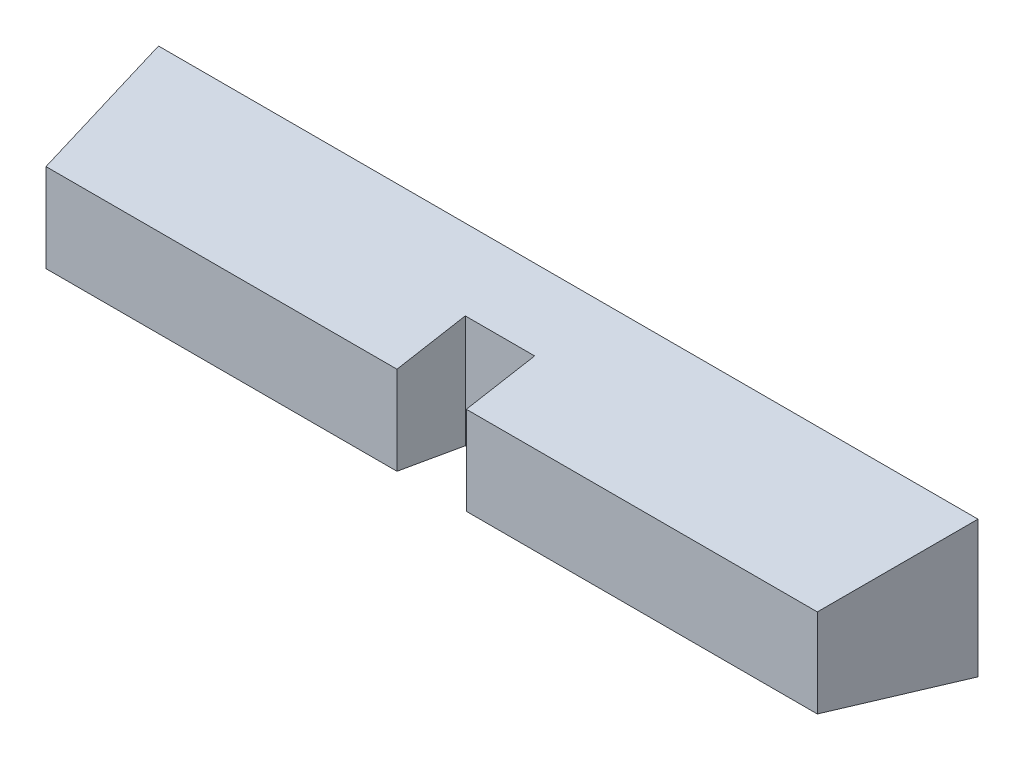
ISO-10303-21;
HEADER;
FILE_DESCRIPTION(('STEP AP214'),'2;1');
FILE_NAME('part.step','',(''),(''),'','','');
FILE_SCHEMA(('AUTOMOTIVE_DESIGN { 1 0 10303 214 1 1 1 1 }'));
ENDSEC;
DATA;
#1=APPLICATION_CONTEXT('core data for automotive mechanical design processes');
#2=APPLICATION_PROTOCOL_DEFINITION('international standard','automotive_design',2000,#1);
#3=PRODUCT_CONTEXT('',#1,'mechanical');
#4=PRODUCT('Part','Part','',(#3));
#5=PRODUCT_RELATED_PRODUCT_CATEGORY('part','',(#4));
#6=PRODUCT_DEFINITION_FORMATION('','',#4);
#7=PRODUCT_DEFINITION_CONTEXT('part definition',#1,'design');
#8=PRODUCT_DEFINITION('design','',#6,#7);
#9=PRODUCT_DEFINITION_SHAPE('','',#8);
#10=(LENGTH_UNIT() NAMED_UNIT(*) SI_UNIT(.MILLI.,.METRE.));
#11=(NAMED_UNIT(*) PLANE_ANGLE_UNIT() SI_UNIT($,.RADIAN.));
#12=(NAMED_UNIT(*) SI_UNIT($,.STERADIAN.) SOLID_ANGLE_UNIT());
#13=UNCERTAINTY_MEASURE_WITH_UNIT(LENGTH_MEASURE(1.E-05),#10,'distance_accuracy_value','');
#14=(GEOMETRIC_REPRESENTATION_CONTEXT(3) GLOBAL_UNCERTAINTY_ASSIGNED_CONTEXT((#13)) GLOBAL_UNIT_ASSIGNED_CONTEXT((#10,
#11,#12)) REPRESENTATION_CONTEXT('',''));
#15=CARTESIAN_POINT('',(0.,0.,0.));
#16=DIRECTION('',(0.,0.,1.));
#17=DIRECTION('',(1.,0.,0.));
#18=AXIS2_PLACEMENT_3D('',#15,#16,#17);
#19=CARTESIAN_POINT('',(30.,-5.,0.));
#20=DIRECTION('',(0.,-0.984807753012208,0.173648177666931));
#21=DIRECTION('',(0.,-0.173648177666931,-0.984807753012208));
#22=AXIS2_PLACEMENT_3D('',#19,#20,#21);
#23=PLANE('',#22);
#24=DIRECTION('',(1.,0.,0.));
#25=VECTOR('',#24,1.);
#26=CARTESIAN_POINT('',(30.,-4.11836509645767,5.));
#27=LINE('',#26,#25);
#28=CARTESIAN_POINT('',(-2.54,-4.11836509645767,5.));
#29=VERTEX_POINT('',#28);
#30=CARTESIAN_POINT('',(2.54,-4.11836509645767,5.));
#31=VERTEX_POINT('',#30);
#32=EDGE_CURVE('E160',#29,#31,#27,.T.);
#33=ORIENTED_EDGE('',*,*,#32,.F.);
#34=DIRECTION('',(0.,0.173648177666931,0.984807753012208));
#35=VECTOR('',#34,1.);
#36=CARTESIAN_POINT('',(-2.54,-5.,0.));
#37=LINE('',#36,#35);
#38=CARTESIAN_POINT('',(-2.54,-3.23673019291535,10.));
#39=VERTEX_POINT('',#38);
#40=EDGE_CURVE('E156',#29,#39,#37,.T.);
#41=ORIENTED_EDGE('',*,*,#40,.T.);
#42=DIRECTION('',(-1.,0.,0.));
#43=VECTOR('',#42,1.);
#44=CARTESIAN_POINT('',(0.,-3.23673019291535,10.));
#45=LINE('',#44,#43);
#46=CARTESIAN_POINT('',(-28.2367301929153,-3.23673019291535,10.));
#47=VERTEX_POINT('',#46);
#48=EDGE_CURVE('E90',#39,#47,#45,.T.);
#49=ORIENTED_EDGE('',*,*,#48,.T.);
#50=DIRECTION('',(-0.171087869746036,-0.171087869746036,-0.970287525247814));
#51=VECTOR('',#50,1.);
#52=CARTESIAN_POINT('',(-28.2437364495458,-3.24373644954581,9.96026554414808));
#53=LINE('',#52,#51);
#54=CARTESIAN_POINT('',(-30.,-5.,0.));
#55=VERTEX_POINT('',#54);
#56=EDGE_CURVE('E148',#47,#55,#53,.T.);
#57=ORIENTED_EDGE('',*,*,#56,.T.);
#58=DIRECTION('',(-1.,0.,0.));
#59=VECTOR('',#58,1.);
#60=CARTESIAN_POINT('',(30.,-5.,0.));
#61=LINE('',#60,#59);
#62=CARTESIAN_POINT('',(30.,-5.,0.));
#63=VERTEX_POINT('',#62);
#64=EDGE_CURVE('E192',#63,#55,#61,.T.);
#65=ORIENTED_EDGE('',*,*,#64,.F.);
#66=DIRECTION('',(-0.171087869746036,0.171087869746036,0.970287525247814));
#67=VECTOR('',#66,1.);
#68=CARTESIAN_POINT('',(30.,-5.,0.));
#69=LINE('',#68,#67);
#70=CARTESIAN_POINT('',(28.2367301929154,-3.23673019291535,10.));
#71=VERTEX_POINT('',#70);
#72=EDGE_CURVE('E70',#71,#63,#69,.F.);
#73=ORIENTED_EDGE('',*,*,#72,.F.);
#74=CARTESIAN_POINT('',(2.54,-3.23673019291535,10.));
#75=VERTEX_POINT('',#74);
#76=EDGE_CURVE('E166',#71,#75,#45,.T.);
#77=ORIENTED_EDGE('',*,*,#76,.T.);
#78=DIRECTION('',(0.,0.173648177666931,0.984807753012208));
#79=VECTOR('',#78,1.);
#80=CARTESIAN_POINT('',(2.54,-5.,0.));
#81=LINE('',#80,#79);
#82=EDGE_CURVE('E61',#31,#75,#81,.T.);
#83=ORIENTED_EDGE('',*,*,#82,.F.);
#84=EDGE_LOOP('',(#33,#41,#49,#57,#65,#73,#77,#83));
#85=FACE_BOUND('',#84,.T.);
#86=ADVANCED_FACE('F45',(#85),#23,.T.);
#87=CARTESIAN_POINT('',(30.,5.,0.));
#88=DIRECTION('',(0.,0.984807753012208,0.173648177666931));
#89=DIRECTION('',(0.,-0.173648177666931,0.984807753012208));
#90=AXIS2_PLACEMENT_3D('',#87,#88,#89);
#91=PLANE('',#90);
#92=DIRECTION('',(0.,0.173648177666931,-0.984807753012208));
#93=VECTOR('',#92,1.);
#94=CARTESIAN_POINT('',(-2.54,5.,0.));
#95=LINE('',#94,#93);
#96=CARTESIAN_POINT('',(-2.54,4.11836509645767,5.));
#97=VERTEX_POINT('',#96);
#98=CARTESIAN_POINT('',(-2.54,3.23673019291535,10.));
#99=VERTEX_POINT('',#98);
#100=EDGE_CURVE('E158',#97,#99,#95,.F.);
#101=ORIENTED_EDGE('',*,*,#100,.F.);
#102=DIRECTION('',(-1.,0.,0.));
#103=VECTOR('',#102,1.);
#104=CARTESIAN_POINT('',(30.,4.11836509645767,5.));
#105=LINE('',#104,#103);
#106=CARTESIAN_POINT('',(2.54,4.11836509645767,5.));
#107=VERTEX_POINT('',#106);
#108=EDGE_CURVE('E11',#97,#107,#105,.F.);
#109=ORIENTED_EDGE('',*,*,#108,.T.);
#110=DIRECTION('',(0.,0.173648177666931,-0.984807753012208));
#111=VECTOR('',#110,1.);
#112=CARTESIAN_POINT('',(2.54,5.,0.));
#113=LINE('',#112,#111);
#114=CARTESIAN_POINT('',(2.54,3.23673019291535,10.));
#115=VERTEX_POINT('',#114);
#116=EDGE_CURVE('E125',#107,#115,#113,.F.);
#117=ORIENTED_EDGE('',*,*,#116,.T.);
#118=DIRECTION('',(1.,0.,0.));
#119=VECTOR('',#118,1.);
#120=CARTESIAN_POINT('',(0.,3.23673019291535,10.));
#121=LINE('',#120,#119);
#122=CARTESIAN_POINT('',(28.2367301929154,3.23673019291535,10.));
#123=VERTEX_POINT('',#122);
#124=EDGE_CURVE('E137',#123,#115,#121,.F.);
#125=ORIENTED_EDGE('',*,*,#124,.F.);
#126=DIRECTION('',(0.171087869746036,0.171087869746036,-0.970287525247814));
#127=VECTOR('',#126,1.);
#128=CARTESIAN_POINT('',(30.,5.,0.));
#129=LINE('',#128,#127);
#130=CARTESIAN_POINT('',(30.,5.,0.));
#131=VERTEX_POINT('',#130);
#132=EDGE_CURVE('E175',#123,#131,#129,.T.);
#133=ORIENTED_EDGE('',*,*,#132,.T.);
#134=DIRECTION('',(-1.,0.,0.));
#135=VECTOR('',#134,1.);
#136=CARTESIAN_POINT('',(30.,5.,0.));
#137=LINE('',#136,#135);
#138=CARTESIAN_POINT('',(-30.,5.,0.));
#139=VERTEX_POINT('',#138);
#140=EDGE_CURVE('E170',#131,#139,#137,.T.);
#141=ORIENTED_EDGE('',*,*,#140,.T.);
#142=DIRECTION('',(0.171087869746036,-0.171087869746036,0.970287525247814));
#143=VECTOR('',#142,1.);
#144=CARTESIAN_POINT('',(-28.2437364495458,3.24373644954581,9.96026554414808));
#145=LINE('',#144,#143);
#146=CARTESIAN_POINT('',(-28.2367301929153,3.23673019291535,10.));
#147=VERTEX_POINT('',#146);
#148=EDGE_CURVE('E178',#147,#139,#145,.F.);
#149=ORIENTED_EDGE('',*,*,#148,.F.);
#150=EDGE_CURVE('E83',#99,#147,#121,.F.);
#151=ORIENTED_EDGE('',*,*,#150,.F.);
#152=EDGE_LOOP('',(#101,#109,#117,#125,#133,#141,#149,#151));
#153=FACE_BOUND('',#152,.T.);
#154=ADVANCED_FACE('F135',(#153),#91,.T.);
#155=CARTESIAN_POINT('',(0.,0.,10.));
#156=DIRECTION('',(0.,0.,-1.));
#157=DIRECTION('',(-1.,0.,0.));
#158=AXIS2_PLACEMENT_3D('',#155,#156,#157);
#159=PLANE('',#158);
#160=DIRECTION('',(0.,-1.,0.));
#161=VECTOR('',#160,1.);
#162=CARTESIAN_POINT('',(-2.54,0.,10.));
#163=LINE('',#162,#161);
#164=EDGE_CURVE('E54',#99,#39,#163,.T.);
#165=ORIENTED_EDGE('',*,*,#164,.F.);
#166=ORIENTED_EDGE('',*,*,#150,.T.);
#167=DIRECTION('',(0.,1.,0.));
#168=VECTOR('',#167,1.);
#169=CARTESIAN_POINT('',(-28.2367301929153,0.,10.));
#170=LINE('',#169,#168);
#171=EDGE_CURVE('E150',#47,#147,#170,.T.);
#172=ORIENTED_EDGE('',*,*,#171,.F.);
#173=ORIENTED_EDGE('',*,*,#48,.F.);
#174=EDGE_LOOP('',(#165,#166,#172,#173));
#175=FACE_BOUND('',#174,.T.);
#176=ADVANCED_FACE('F163',(#175),#159,.F.);
#177=CARTESIAN_POINT('',(30.,-5.,0.));
#178=DIRECTION('',(0.984807753012208,0.,0.173648177666931));
#179=DIRECTION('',(0.173648177666931,0.,-0.984807753012208));
#180=AXIS2_PLACEMENT_3D('',#177,#178,#179);
#181=PLANE('',#180);
#182=DIRECTION('',(0.,1.,0.));
#183=VECTOR('',#182,1.);
#184=CARTESIAN_POINT('',(30.,-5.,0.));
#185=LINE('',#184,#183);
#186=EDGE_CURVE('E167',#63,#131,#185,.T.);
#187=ORIENTED_EDGE('',*,*,#186,.T.);
#188=ORIENTED_EDGE('',*,*,#132,.F.);
#189=DIRECTION('',(0.,-1.,0.));
#190=VECTOR('',#189,1.);
#191=CARTESIAN_POINT('',(28.2367301929154,0.,10.));
#192=LINE('',#191,#190);
#193=EDGE_CURVE('E142',#71,#123,#192,.F.);
#194=ORIENTED_EDGE('',*,*,#193,.F.);
#195=ORIENTED_EDGE('',*,*,#72,.T.);
#196=EDGE_LOOP('',(#187,#188,#194,#195));
#197=FACE_BOUND('',#196,.T.);
#198=ADVANCED_FACE('F47',(#197),#181,.T.);
#199=CARTESIAN_POINT('',(-30.,-5.,0.));
#200=DIRECTION('',(-0.984807753012208,0.,0.173648177666931));
#201=DIRECTION('',(0.173648177666931,0.,0.984807753012208));
#202=AXIS2_PLACEMENT_3D('',#199,#200,#201);
#203=PLANE('',#202);
#204=DIRECTION('',(0.,1.,0.));
#205=VECTOR('',#204,1.);
#206=CARTESIAN_POINT('',(-30.,-5.,0.));
#207=LINE('',#206,#205);
#208=EDGE_CURVE('E188',#55,#139,#207,.T.);
#209=ORIENTED_EDGE('',*,*,#208,.F.);
#210=ORIENTED_EDGE('',*,*,#56,.F.);
#211=ORIENTED_EDGE('',*,*,#171,.T.);
#212=ORIENTED_EDGE('',*,*,#148,.T.);
#213=EDGE_LOOP('',(#209,#210,#211,#212));
#214=FACE_BOUND('',#213,.T.);
#215=ADVANCED_FACE('F210',(#214),#203,.T.);
#216=ORIENTED_EDGE('',*,*,#124,.T.);
#217=DIRECTION('',(0.,-1.,0.));
#218=VECTOR('',#217,1.);
#219=CARTESIAN_POINT('',(2.54,0.,10.));
#220=LINE('',#219,#218);
#221=EDGE_CURVE('E122',#115,#75,#220,.T.);
#222=ORIENTED_EDGE('',*,*,#221,.T.);
#223=ORIENTED_EDGE('',*,*,#76,.F.);
#224=ORIENTED_EDGE('',*,*,#193,.T.);
#225=EDGE_LOOP('',(#216,#222,#223,#224));
#226=FACE_BOUND('',#225,.T.);
#227=ADVANCED_FACE('F141',(#226),#159,.F.);
#228=CARTESIAN_POINT('',(0.,0.,0.));
#229=DIRECTION('',(0.,0.,-1.));
#230=DIRECTION('',(-1.,0.,0.));
#231=AXIS2_PLACEMENT_3D('',#228,#229,#230);
#232=PLANE('',#231);
#233=ORIENTED_EDGE('',*,*,#64,.T.);
#234=ORIENTED_EDGE('',*,*,#208,.T.);
#235=ORIENTED_EDGE('',*,*,#140,.F.);
#236=ORIENTED_EDGE('',*,*,#186,.F.);
#237=EDGE_LOOP('',(#233,#234,#235,#236));
#238=FACE_BOUND('',#237,.T.);
#239=ADVANCED_FACE('F212',(#238),#232,.T.);
#240=CARTESIAN_POINT('',(0.,0.,5.));
#241=DIRECTION('',(0.,0.,-1.));
#242=DIRECTION('',(-1.,0.,0.));
#243=AXIS2_PLACEMENT_3D('',#240,#241,#242);
#244=PLANE('',#243);
#245=ORIENTED_EDGE('',*,*,#32,.T.);
#246=DIRECTION('',(0.,1.,0.));
#247=VECTOR('',#246,1.);
#248=CARTESIAN_POINT('',(2.54,-15.,5.));
#249=LINE('',#248,#247);
#250=EDGE_CURVE('E139',#31,#107,#249,.T.);
#251=ORIENTED_EDGE('',*,*,#250,.T.);
#252=ORIENTED_EDGE('',*,*,#108,.F.);
#253=DIRECTION('',(0.,1.,0.));
#254=VECTOR('',#253,1.);
#255=CARTESIAN_POINT('',(-2.54,-15.,5.));
#256=LINE('',#255,#254);
#257=EDGE_CURVE('E204',#29,#97,#256,.T.);
#258=ORIENTED_EDGE('',*,*,#257,.F.);
#259=EDGE_LOOP('',(#245,#251,#252,#258));
#260=FACE_BOUND('',#259,.T.);
#261=ADVANCED_FACE('F227',(#260),#244,.F.);
#262=CARTESIAN_POINT('',(-2.54,-15.,5.));
#263=DIRECTION('',(1.,0.,0.));
#264=DIRECTION('',(0.,0.,-1.));
#265=AXIS2_PLACEMENT_3D('',#262,#263,#264);
#266=PLANE('',#265);
#267=ORIENTED_EDGE('',*,*,#257,.T.);
#268=ORIENTED_EDGE('',*,*,#100,.T.);
#269=ORIENTED_EDGE('',*,*,#164,.T.);
#270=ORIENTED_EDGE('',*,*,#40,.F.);
#271=EDGE_LOOP('',(#267,#268,#269,#270));
#272=FACE_BOUND('',#271,.T.);
#273=ADVANCED_FACE('F155',(#272),#266,.T.);
#274=CARTESIAN_POINT('',(2.54,-15.,5.));
#275=DIRECTION('',(1.,0.,0.));
#276=DIRECTION('',(0.,0.,-1.));
#277=AXIS2_PLACEMENT_3D('',#274,#275,#276);
#278=PLANE('',#277);
#279=ORIENTED_EDGE('',*,*,#82,.T.);
#280=ORIENTED_EDGE('',*,*,#221,.F.);
#281=ORIENTED_EDGE('',*,*,#116,.F.);
#282=ORIENTED_EDGE('',*,*,#250,.F.);
#283=EDGE_LOOP('',(#279,#280,#281,#282));
#284=FACE_BOUND('',#283,.T.);
#285=ADVANCED_FACE('F124',(#284),#278,.F.);
#286=CLOSED_SHELL('',(#86,#154,#176,#198,#215,#227,#239,#261,#273,#285));
#287=MANIFOLD_SOLID_BREP('B2',#286);
#288=ADVANCED_BREP_SHAPE_REPRESENTATION('',(#18,#287),#14);
#289=SHAPE_DEFINITION_REPRESENTATION(#9,#288);
ENDSEC;
END-ISO-10303-21;
